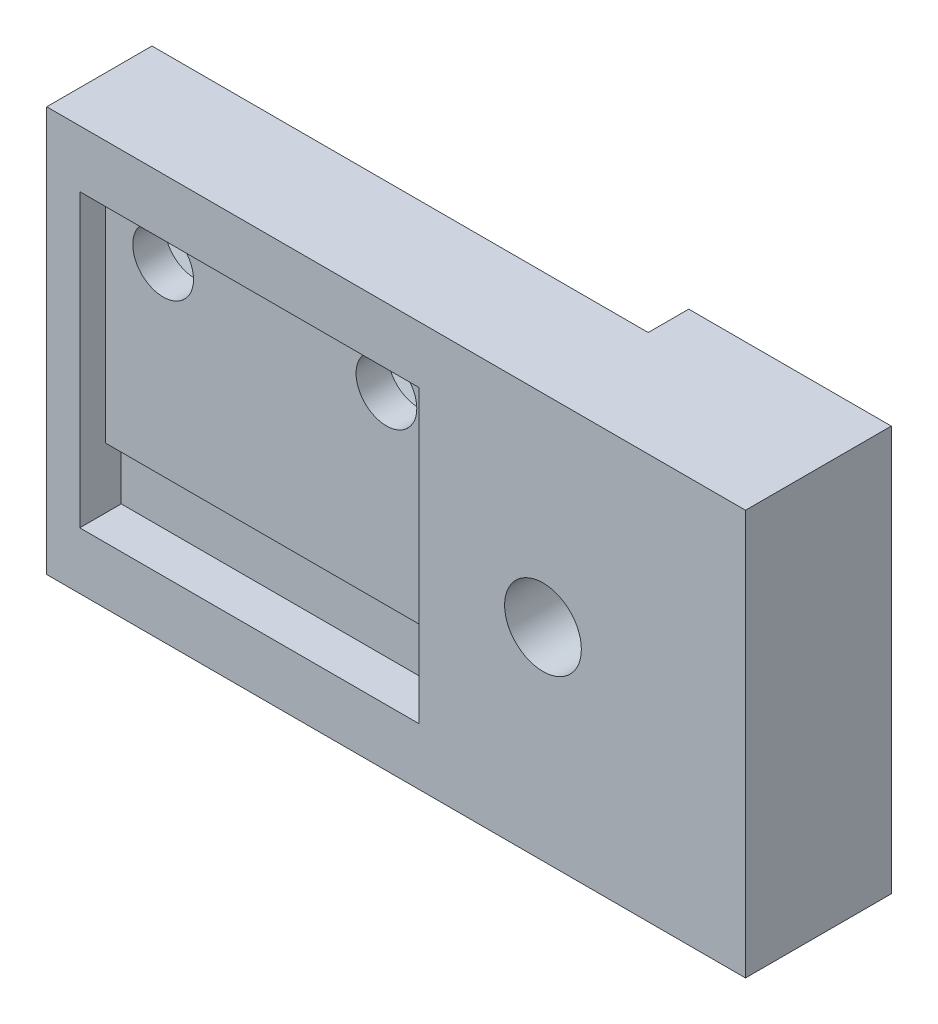
ISO-10303-21;
HEADER;
FILE_DESCRIPTION(('STEP AP214'),'2;1');
FILE_NAME('part.step','',(''),(''),'','','');
FILE_SCHEMA(('AUTOMOTIVE_DESIGN { 1 0 10303 214 1 1 1 1 }'));
ENDSEC;
DATA;
#1=APPLICATION_CONTEXT('core data for automotive mechanical design processes');
#2=APPLICATION_PROTOCOL_DEFINITION('international standard','automotive_design',2000,#1);
#3=PRODUCT_CONTEXT('',#1,'mechanical');
#4=PRODUCT('Part','Part','',(#3));
#5=PRODUCT_RELATED_PRODUCT_CATEGORY('part','',(#4));
#6=PRODUCT_DEFINITION_FORMATION('','',#4);
#7=PRODUCT_DEFINITION_CONTEXT('part definition',#1,'design');
#8=PRODUCT_DEFINITION('design','',#6,#7);
#9=PRODUCT_DEFINITION_SHAPE('','',#8);
#10=(LENGTH_UNIT() NAMED_UNIT(*) SI_UNIT(.MILLI.,.METRE.));
#11=(NAMED_UNIT(*) PLANE_ANGLE_UNIT() SI_UNIT($,.RADIAN.));
#12=(NAMED_UNIT(*) SI_UNIT($,.STERADIAN.) SOLID_ANGLE_UNIT());
#13=UNCERTAINTY_MEASURE_WITH_UNIT(LENGTH_MEASURE(1.E-05),#10,'distance_accuracy_value','');
#14=(GEOMETRIC_REPRESENTATION_CONTEXT(3) GLOBAL_UNCERTAINTY_ASSIGNED_CONTEXT((#13)) GLOBAL_UNIT_ASSIGNED_CONTEXT((#10,
#11,#12)) REPRESENTATION_CONTEXT('',''));
#15=CARTESIAN_POINT('',(0.,0.,0.));
#16=DIRECTION('',(0.,0.,1.));
#17=DIRECTION('',(1.,0.,0.));
#18=AXIS2_PLACEMENT_3D('',#15,#16,#17);
#19=CARTESIAN_POINT('',(0.,0.,0.));
#20=DIRECTION('',(0.,0.,-1.));
#21=DIRECTION('',(-1.,0.,0.));
#22=AXIS2_PLACEMENT_3D('',#19,#20,#21);
#23=PLANE('',#22);
#24=CARTESIAN_POINT('',(19.7,19.026000048,0.));
#25=DIRECTION('',(0.,0.,1.));
#26=DIRECTION('',(1.,0.,0.));
#27=AXIS2_PLACEMENT_3D('',#24,#25,#26);
#28=CIRCLE('',#27,1.9039967);
#29=CARTESIAN_POINT('',(21.6039967,19.026000048,0.));
#30=VERTEX_POINT('',#29);
#31=EDGE_CURVE('E556',#30,#30,#28,.T.);
#32=ORIENTED_EDGE('',*,*,#31,.T.);
#33=EDGE_LOOP('',(#32));
#34=FACE_BOUND('',#33,.T.);
#35=DIRECTION('',(-0.866025403784439,-0.5,0.));
#36=VECTOR('',#35,1.);
#37=CARTESIAN_POINT('',(22.8309945,17.2183195305938,0.));
#38=LINE('',#37,#36);
#39=CARTESIAN_POINT('',(22.8309945,17.2183195305938,0.));
#40=VERTEX_POINT('',#39);
#41=CARTESIAN_POINT('',(19.7,15.4106390131875,0.));
#42=VERTEX_POINT('',#41);
#43=EDGE_CURVE('E435',#40,#42,#38,.T.);
#44=ORIENTED_EDGE('',*,*,#43,.T.);
#45=DIRECTION('',(-0.866025403784439,0.5,0.));
#46=VECTOR('',#45,1.);
#47=CARTESIAN_POINT('',(19.7,15.4106390131875,0.));
#48=LINE('',#47,#46);
#49=CARTESIAN_POINT('',(16.5690055,17.2183195305938,0.));
#50=VERTEX_POINT('',#49);
#51=EDGE_CURVE('E430',#42,#50,#48,.T.);
#52=ORIENTED_EDGE('',*,*,#51,.T.);
#53=DIRECTION('',(0.,1.,0.));
#54=VECTOR('',#53,1.);
#55=CARTESIAN_POINT('',(16.5690055,17.2183195305938,0.));
#56=LINE('',#55,#54);
#57=CARTESIAN_POINT('',(16.5690055,20.8336805654062,0.));
#58=VERTEX_POINT('',#57);
#59=EDGE_CURVE('E455',#50,#58,#56,.T.);
#60=ORIENTED_EDGE('',*,*,#59,.T.);
#61=DIRECTION('',(0.866025403784438,0.5,0.));
#62=VECTOR('',#61,1.);
#63=CARTESIAN_POINT('',(16.5690055,20.8336805654062,0.));
#64=LINE('',#63,#62);
#65=CARTESIAN_POINT('',(19.7,22.6413610828125,0.));
#66=VERTEX_POINT('',#65);
#67=EDGE_CURVE('E459',#58,#66,#64,.T.);
#68=ORIENTED_EDGE('',*,*,#67,.T.);
#69=DIRECTION('',(0.866025403784438,-0.5,0.));
#70=VECTOR('',#69,1.);
#71=CARTESIAN_POINT('',(19.7,22.6413610828125,0.));
#72=LINE('',#71,#70);
#73=CARTESIAN_POINT('',(22.8309945,20.8336805654062,0.));
#74=VERTEX_POINT('',#73);
#75=EDGE_CURVE('E463',#66,#74,#72,.T.);
#76=ORIENTED_EDGE('',*,*,#75,.T.);
#77=DIRECTION('',(0.,-1.,0.));
#78=VECTOR('',#77,1.);
#79=CARTESIAN_POINT('',(22.8309945,20.8336805654062,0.));
#80=LINE('',#79,#78);
#81=EDGE_CURVE('E467',#74,#40,#80,.T.);
#82=ORIENTED_EDGE('',*,*,#81,.T.);
#83=EDGE_LOOP('',(#44,#52,#60,#68,#76,#82));
#84=FACE_BOUND('',#83,.T.);
#85=ADVANCED_FACE('F39',(#34,#84),#23,.T.);
#86=CARTESIAN_POINT('',(5.7,19.026000048,0.));
#87=DIRECTION('',(0.,0.,1.));
#88=DIRECTION('',(1.,0.,0.));
#89=AXIS2_PLACEMENT_3D('',#86,#87,#88);
#90=CIRCLE('',#89,1.9039967);
#91=CARTESIAN_POINT('',(7.6039967,19.026000048,0.));
#92=VERTEX_POINT('',#91);
#93=EDGE_CURVE('E561',#92,#92,#90,.T.);
#94=ORIENTED_EDGE('',*,*,#93,.T.);
#95=EDGE_LOOP('',(#94));
#96=FACE_BOUND('',#95,.T.);
#97=DIRECTION('',(-0.866025403784438,0.500000000000001,0.));
#98=VECTOR('',#97,1.);
#99=CARTESIAN_POINT('',(5.69999999999999,15.4106390131875,0.));
#100=LINE('',#99,#98);
#101=CARTESIAN_POINT('',(5.69999999999999,15.4106390131875,0.));
#102=VERTEX_POINT('',#101);
#103=CARTESIAN_POINT('',(2.56900549999999,17.2183195305938,0.));
#104=VERTEX_POINT('',#103);
#105=EDGE_CURVE('E373',#102,#104,#100,.T.);
#106=ORIENTED_EDGE('',*,*,#105,.T.);
#107=DIRECTION('',(0.,1.,0.));
#108=VECTOR('',#107,1.);
#109=CARTESIAN_POINT('',(2.56900549999999,17.2183195305938,0.));
#110=LINE('',#109,#108);
#111=CARTESIAN_POINT('',(2.56900549999999,20.8336805654062,0.));
#112=VERTEX_POINT('',#111);
#113=EDGE_CURVE('E368',#104,#112,#110,.T.);
#114=ORIENTED_EDGE('',*,*,#113,.T.);
#115=DIRECTION('',(0.866025403784439,0.5,0.));
#116=VECTOR('',#115,1.);
#117=CARTESIAN_POINT('',(2.56900549999999,20.8336805654062,0.));
#118=LINE('',#117,#116);
#119=CARTESIAN_POINT('',(5.69999999999999,22.6413610828125,0.));
#120=VERTEX_POINT('',#119);
#121=EDGE_CURVE('E393',#112,#120,#118,.T.);
#122=ORIENTED_EDGE('',*,*,#121,.T.);
#123=DIRECTION('',(0.866025403784439,-0.5,0.));
#124=VECTOR('',#123,1.);
#125=CARTESIAN_POINT('',(5.69999999999999,22.6413610828125,0.));
#126=LINE('',#125,#124);
#127=CARTESIAN_POINT('',(8.83099449999999,20.8336805654062,0.));
#128=VERTEX_POINT('',#127);
#129=EDGE_CURVE('E397',#120,#128,#126,.T.);
#130=ORIENTED_EDGE('',*,*,#129,.T.);
#131=DIRECTION('',(0.,-1.,0.));
#132=VECTOR('',#131,1.);
#133=CARTESIAN_POINT('',(8.83099449999999,20.8336805654062,0.));
#134=LINE('',#133,#132);
#135=CARTESIAN_POINT('',(8.83099449999999,17.2183195305938,0.));
#136=VERTEX_POINT('',#135);
#137=EDGE_CURVE('E401',#128,#136,#134,.T.);
#138=ORIENTED_EDGE('',*,*,#137,.T.);
#139=DIRECTION('',(-0.866025403784439,-0.5,0.));
#140=VECTOR('',#139,1.);
#141=CARTESIAN_POINT('',(8.83099449999999,17.2183195305938,0.));
#142=LINE('',#141,#140);
#143=EDGE_CURVE('E405',#136,#102,#142,.T.);
#144=ORIENTED_EDGE('',*,*,#143,.T.);
#145=EDGE_LOOP('',(#106,#114,#122,#130,#138,#144));
#146=FACE_BOUND('',#145,.T.);
#147=ADVANCED_FACE('F655',(#96,#146),#23,.T.);
#148=CARTESIAN_POINT('',(0.,0.,2.));
#149=DIRECTION('',(0.,0.,-1.));
#150=DIRECTION('',(-1.,0.,0.));
#151=AXIS2_PLACEMENT_3D('',#148,#149,#150);
#152=PLANE('',#151);
#153=DIRECTION('',(0.,-1.,0.));
#154=VECTOR('',#153,1.);
#155=CARTESIAN_POINT('',(2.073,3.573,2.));
#156=LINE('',#155,#154);
#157=CARTESIAN_POINT('',(2.073,21.827,2.));
#158=VERTEX_POINT('',#157);
#159=CARTESIAN_POINT('',(2.073,7.383,2.));
#160=VERTEX_POINT('',#159);
#161=EDGE_CURVE('E515',#158,#160,#156,.T.);
#162=ORIENTED_EDGE('',*,*,#161,.T.);
#163=DIRECTION('',(-1.,0.,0.));
#164=VECTOR('',#163,1.);
#165=CARTESIAN_POINT('',(2.073,7.383,2.));
#166=LINE('',#165,#164);
#167=CARTESIAN_POINT('',(23.327,7.383,2.));
#168=VERTEX_POINT('',#167);
#169=EDGE_CURVE('E265',#168,#160,#166,.T.);
#170=ORIENTED_EDGE('',*,*,#169,.F.);
#171=DIRECTION('',(0.,1.,0.));
#172=VECTOR('',#171,1.);
#173=CARTESIAN_POINT('',(23.327,3.573,2.));
#174=LINE('',#173,#172);
#175=CARTESIAN_POINT('',(23.327,21.827,2.));
#176=VERTEX_POINT('',#175);
#177=EDGE_CURVE('E510',#168,#176,#174,.T.);
#178=ORIENTED_EDGE('',*,*,#177,.T.);
#179=DIRECTION('',(-1.,0.,0.));
#180=VECTOR('',#179,1.);
#181=CARTESIAN_POINT('',(2.073,21.827,2.));
#182=LINE('',#181,#180);
#183=EDGE_CURVE('E525',#176,#158,#182,.T.);
#184=ORIENTED_EDGE('',*,*,#183,.T.);
#185=EDGE_LOOP('',(#162,#170,#178,#184));
#186=FACE_BOUND('',#185,.T.);
#187=CARTESIAN_POINT('',(5.7,19.026000048,2.));
#188=DIRECTION('',(0.,0.,1.));
#189=DIRECTION('',(1.,0.,0.));
#190=AXIS2_PLACEMENT_3D('',#187,#188,#189);
#191=CIRCLE('',#190,1.9039967);
#192=CARTESIAN_POINT('',(7.6039967,19.026000048,2.));
#193=VERTEX_POINT('',#192);
#194=EDGE_CURVE('E565',#193,#193,#191,.T.);
#195=ORIENTED_EDGE('',*,*,#194,.F.);
#196=EDGE_LOOP('',(#195));
#197=FACE_BOUND('',#196,.T.);
#198=CARTESIAN_POINT('',(19.7,19.026000048,2.));
#199=DIRECTION('',(0.,0.,1.));
#200=DIRECTION('',(1.,0.,0.));
#201=AXIS2_PLACEMENT_3D('',#198,#199,#200);
#202=CIRCLE('',#201,1.9039967);
#203=CARTESIAN_POINT('',(21.6039967,19.026000048,2.));
#204=VERTEX_POINT('',#203);
#205=EDGE_CURVE('E557',#204,#204,#202,.T.);
#206=ORIENTED_EDGE('',*,*,#205,.F.);
#207=EDGE_LOOP('',(#206));
#208=FACE_BOUND('',#207,.T.);
#209=ADVANCED_FACE('F684',(#186,#197,#208),#152,.F.);
#210=CARTESIAN_POINT('',(0.,0.,2.));
#211=DIRECTION('',(1.,0.,0.));
#212=DIRECTION('',(0.,0.,-1.));
#213=AXIS2_PLACEMENT_3D('',#210,#211,#212);
#214=PLANE('',#213);
#215=DIRECTION('',(0.,0.,-1.));
#216=VECTOR('',#215,1.);
#217=CARTESIAN_POINT('',(0.,25.4,2.));
#218=LINE('',#217,#216);
#219=CARTESIAN_POINT('',(0.,25.4,3.6));
#220=VERTEX_POINT('',#219);
#221=CARTESIAN_POINT('',(0.,25.4,-3.));
#222=VERTEX_POINT('',#221);
#223=EDGE_CURVE('E569',#220,#222,#218,.T.);
#224=ORIENTED_EDGE('',*,*,#223,.T.);
#225=DIRECTION('',(0.,1.,0.));
#226=VECTOR('',#225,1.);
#227=CARTESIAN_POINT('',(0.,0.,-3.));
#228=LINE('',#227,#226);
#229=CARTESIAN_POINT('',(0.,0.,-3.));
#230=VERTEX_POINT('',#229);
#231=EDGE_CURVE('E499',#230,#222,#228,.T.);
#232=ORIENTED_EDGE('',*,*,#231,.F.);
#233=DIRECTION('',(0.,0.,-1.));
#234=VECTOR('',#233,1.);
#235=CARTESIAN_POINT('',(0.,0.,2.));
#236=LINE('',#235,#234);
#237=CARTESIAN_POINT('',(0.,0.,3.6));
#238=VERTEX_POINT('',#237);
#239=EDGE_CURVE('E11',#238,#230,#236,.T.);
#240=ORIENTED_EDGE('',*,*,#239,.F.);
#241=DIRECTION('',(0.,-1.,0.));
#242=VECTOR('',#241,1.);
#243=CARTESIAN_POINT('',(0.,25.4,3.6));
#244=LINE('',#243,#242);
#245=EDGE_CURVE('E544',#220,#238,#244,.T.);
#246=ORIENTED_EDGE('',*,*,#245,.F.);
#247=EDGE_LOOP('',(#224,#232,#240,#246));
#248=FACE_BOUND('',#247,.T.);
#249=ADVANCED_FACE('F41',(#248),#214,.F.);
#250=CARTESIAN_POINT('',(0.,0.,2.));
#251=DIRECTION('',(0.,1.,0.));
#252=DIRECTION('',(0.,0.,1.));
#253=AXIS2_PLACEMENT_3D('',#250,#251,#252);
#254=PLANE('',#253);
#255=ORIENTED_EDGE('',*,*,#239,.T.);
#256=DIRECTION('',(-1.,0.,0.));
#257=VECTOR('',#256,1.);
#258=CARTESIAN_POINT('',(43.815,0.,-3.));
#259=LINE('',#258,#257);
#260=CARTESIAN_POINT('',(31.115,0.,-3.));
#261=VERTEX_POINT('',#260);
#262=EDGE_CURVE('E496',#261,#230,#259,.T.);
#263=ORIENTED_EDGE('',*,*,#262,.F.);
#264=DIRECTION('',(0.,0.,1.));
#265=VECTOR('',#264,1.);
#266=CARTESIAN_POINT('',(31.115,0.,-5.54));
#267=LINE('',#266,#265);
#268=CARTESIAN_POINT('',(31.115,0.,-5.54));
#269=VERTEX_POINT('',#268);
#270=EDGE_CURVE('E364',#269,#261,#267,.T.);
#271=ORIENTED_EDGE('',*,*,#270,.F.);
#272=DIRECTION('',(-1.,0.,0.));
#273=VECTOR('',#272,1.);
#274=CARTESIAN_POINT('',(43.815,0.,-5.54));
#275=LINE('',#274,#273);
#276=CARTESIAN_POINT('',(43.815,0.,-5.54));
#277=VERTEX_POINT('',#276);
#278=EDGE_CURVE('E290',#277,#269,#275,.T.);
#279=ORIENTED_EDGE('',*,*,#278,.F.);
#280=DIRECTION('',(0.,0.,-1.));
#281=VECTOR('',#280,1.);
#282=CARTESIAN_POINT('',(43.815,0.,2.));
#283=LINE('',#282,#281);
#284=CARTESIAN_POINT('',(43.815,0.,3.6));
#285=VERTEX_POINT('',#284);
#286=EDGE_CURVE('E48',#285,#277,#283,.T.);
#287=ORIENTED_EDGE('',*,*,#286,.F.);
#288=DIRECTION('',(1.,0.,0.));
#289=VECTOR('',#288,1.);
#290=CARTESIAN_POINT('',(0.,0.,3.6));
#291=LINE('',#290,#289);
#292=EDGE_CURVE('E548',#238,#285,#291,.T.);
#293=ORIENTED_EDGE('',*,*,#292,.F.);
#294=EDGE_LOOP('',(#255,#263,#271,#279,#287,#293));
#295=FACE_BOUND('',#294,.T.);
#296=ADVANCED_FACE('F589',(#295),#254,.F.);
#297=CARTESIAN_POINT('',(43.815,0.,2.));
#298=DIRECTION('',(-1.,0.,0.));
#299=DIRECTION('',(0.,0.,1.));
#300=AXIS2_PLACEMENT_3D('',#297,#298,#299);
#301=PLANE('',#300);
#302=ORIENTED_EDGE('',*,*,#286,.T.);
#303=DIRECTION('',(0.,-1.,0.));
#304=VECTOR('',#303,1.);
#305=CARTESIAN_POINT('',(43.815,25.4,-5.54));
#306=LINE('',#305,#304);
#307=CARTESIAN_POINT('',(43.815,25.4,-5.54));
#308=VERTEX_POINT('',#307);
#309=EDGE_CURVE('E286',#308,#277,#306,.T.);
#310=ORIENTED_EDGE('',*,*,#309,.F.);
#311=DIRECTION('',(0.,0.,-1.));
#312=VECTOR('',#311,1.);
#313=CARTESIAN_POINT('',(43.815,25.4,2.));
#314=LINE('',#313,#312);
#315=CARTESIAN_POINT('',(43.815,25.4,3.6));
#316=VERTEX_POINT('',#315);
#317=EDGE_CURVE('E575',#316,#308,#314,.T.);
#318=ORIENTED_EDGE('',*,*,#317,.F.);
#319=DIRECTION('',(0.,1.,0.));
#320=VECTOR('',#319,1.);
#321=CARTESIAN_POINT('',(43.815,0.,3.6));
#322=LINE('',#321,#320);
#323=EDGE_CURVE('E552',#285,#316,#322,.T.);
#324=ORIENTED_EDGE('',*,*,#323,.F.);
#325=EDGE_LOOP('',(#302,#310,#318,#324));
#326=FACE_BOUND('',#325,.T.);
#327=ADVANCED_FACE('F581',(#326),#301,.F.);
#328=CARTESIAN_POINT('',(0.,25.4,2.));
#329=DIRECTION('',(0.,-1.,0.));
#330=DIRECTION('',(0.,0.,-1.));
#331=AXIS2_PLACEMENT_3D('',#328,#329,#330);
#332=PLANE('',#331);
#333=ORIENTED_EDGE('',*,*,#317,.T.);
#334=DIRECTION('',(1.,0.,0.));
#335=VECTOR('',#334,1.);
#336=CARTESIAN_POINT('',(31.115,25.4,-5.54));
#337=LINE('',#336,#335);
#338=CARTESIAN_POINT('',(31.115,25.4,-5.54));
#339=VERTEX_POINT('',#338);
#340=EDGE_CURVE('E282',#339,#308,#337,.T.);
#341=ORIENTED_EDGE('',*,*,#340,.F.);
#342=DIRECTION('',(0.,0.,1.));
#343=VECTOR('',#342,1.);
#344=CARTESIAN_POINT('',(31.115,25.4,-5.54));
#345=LINE('',#344,#343);
#346=CARTESIAN_POINT('',(31.115,25.4,-3.));
#347=VERTEX_POINT('',#346);
#348=EDGE_CURVE('E314',#339,#347,#345,.T.);
#349=ORIENTED_EDGE('',*,*,#348,.T.);
#350=DIRECTION('',(1.,0.,0.));
#351=VECTOR('',#350,1.);
#352=CARTESIAN_POINT('',(0.,25.4,-3.));
#353=LINE('',#352,#351);
#354=EDGE_CURVE('E503',#222,#347,#353,.T.);
#355=ORIENTED_EDGE('',*,*,#354,.F.);
#356=ORIENTED_EDGE('',*,*,#223,.F.);
#357=DIRECTION('',(-1.,0.,0.));
#358=VECTOR('',#357,1.);
#359=CARTESIAN_POINT('',(43.815,25.4,3.6));
#360=LINE('',#359,#358);
#361=EDGE_CURVE('E540',#316,#220,#360,.T.);
#362=ORIENTED_EDGE('',*,*,#361,.F.);
#363=EDGE_LOOP('',(#333,#341,#349,#355,#356,#362));
#364=FACE_BOUND('',#363,.T.);
#365=ADVANCED_FACE('F621',(#364),#332,.F.);
#366=CARTESIAN_POINT('',(5.7,19.026000048,2.));
#367=DIRECTION('',(0.,0.,-1.));
#368=DIRECTION('',(-1.,0.,0.));
#369=AXIS2_PLACEMENT_3D('',#366,#367,#368);
#370=CYLINDRICAL_SURFACE('',#369,1.9039967);
#371=ORIENTED_EDGE('',*,*,#194,.T.);
#372=EDGE_LOOP('',(#371));
#373=FACE_BOUND('',#372,.T.);
#374=ORIENTED_EDGE('',*,*,#93,.F.);
#375=EDGE_LOOP('',(#374));
#376=FACE_BOUND('',#375,.T.);
#377=ADVANCED_FACE('F692',(#373,#376),#370,.F.);
#378=CARTESIAN_POINT('',(19.7,19.026000048,2.));
#379=DIRECTION('',(0.,0.,-1.));
#380=DIRECTION('',(-1.,0.,0.));
#381=AXIS2_PLACEMENT_3D('',#378,#379,#380);
#382=CYLINDRICAL_SURFACE('',#381,1.9039967);
#383=ORIENTED_EDGE('',*,*,#205,.T.);
#384=EDGE_LOOP('',(#383));
#385=FACE_BOUND('',#384,.T.);
#386=ORIENTED_EDGE('',*,*,#31,.F.);
#387=EDGE_LOOP('',(#386));
#388=FACE_BOUND('',#387,.T.);
#389=ADVANCED_FACE('F710',(#385,#388),#382,.F.);
#390=CARTESIAN_POINT('',(31.115,12.7,2.));
#391=DIRECTION('',(0.,0.,-1.));
#392=DIRECTION('',(-1.,0.,0.));
#393=AXIS2_PLACEMENT_3D('',#390,#391,#392);
#394=CYLINDRICAL_SURFACE('',#393,2.40665);
#395=CARTESIAN_POINT('',(31.115,12.7,3.6));
#396=DIRECTION('',(0.,0.,1.));
#397=DIRECTION('',(1.,0.,0.));
#398=AXIS2_PLACEMENT_3D('',#395,#396,#397);
#399=CIRCLE('',#398,2.40665);
#400=CARTESIAN_POINT('',(33.52165,12.7,3.6));
#401=VERTEX_POINT('',#400);
#402=EDGE_CURVE('E506',#401,#401,#399,.T.);
#403=ORIENTED_EDGE('',*,*,#402,.T.);
#404=EDGE_LOOP('',(#403));
#405=FACE_BOUND('',#404,.T.);
#406=CARTESIAN_POINT('',(31.115,12.7,-3.));
#407=DIRECTION('',(0.,0.,-1.));
#408=DIRECTION('',(-1.,0.,0.));
#409=AXIS2_PLACEMENT_3D('',#406,#407,#408);
#410=CIRCLE('',#409,2.40665);
#411=CARTESIAN_POINT('',(28.70835,12.7,-3.));
#412=VERTEX_POINT('',#411);
#413=EDGE_CURVE('E492',#412,#412,#410,.T.);
#414=ORIENTED_EDGE('',*,*,#413,.T.);
#415=EDGE_LOOP('',(#414));
#416=FACE_BOUND('',#415,.T.);
#417=ADVANCED_FACE('F713',(#405,#416),#394,.F.);
#418=CARTESIAN_POINT('',(0.,0.,3.6));
#419=DIRECTION('',(0.,0.,1.));
#420=DIRECTION('',(1.,0.,0.));
#421=AXIS2_PLACEMENT_3D('',#418,#419,#420);
#422=PLANE('',#421);
#423=DIRECTION('',(-1.,0.,0.));
#424=VECTOR('',#423,1.);
#425=CARTESIAN_POINT('',(2.073,21.827,3.6));
#426=LINE('',#425,#424);
#427=CARTESIAN_POINT('',(23.327,21.827,3.6));
#428=VERTEX_POINT('',#427);
#429=CARTESIAN_POINT('',(2.073,21.827,3.6));
#430=VERTEX_POINT('',#429);
#431=EDGE_CURVE('E514',#428,#430,#426,.T.);
#432=ORIENTED_EDGE('',*,*,#431,.F.);
#433=DIRECTION('',(0.,1.,0.));
#434=VECTOR('',#433,1.);
#435=CARTESIAN_POINT('',(23.327,3.573,3.6));
#436=LINE('',#435,#434);
#437=CARTESIAN_POINT('',(23.327,3.573,3.6));
#438=VERTEX_POINT('',#437);
#439=EDGE_CURVE('E511',#438,#428,#436,.T.);
#440=ORIENTED_EDGE('',*,*,#439,.F.);
#441=DIRECTION('',(1.,0.,0.));
#442=VECTOR('',#441,1.);
#443=CARTESIAN_POINT('',(2.073,3.573,3.6));
#444=LINE('',#443,#442);
#445=CARTESIAN_POINT('',(2.073,3.573,3.6));
#446=VERTEX_POINT('',#445);
#447=EDGE_CURVE('E520',#446,#438,#444,.T.);
#448=ORIENTED_EDGE('',*,*,#447,.F.);
#449=DIRECTION('',(0.,-1.,0.));
#450=VECTOR('',#449,1.);
#451=CARTESIAN_POINT('',(2.073,3.573,3.6));
#452=LINE('',#451,#450);
#453=EDGE_CURVE('E244',#430,#446,#452,.T.);
#454=ORIENTED_EDGE('',*,*,#453,.F.);
#455=EDGE_LOOP('',(#432,#440,#448,#454));
#456=FACE_BOUND('',#455,.T.);
#457=ORIENTED_EDGE('',*,*,#361,.T.);
#458=ORIENTED_EDGE('',*,*,#245,.T.);
#459=ORIENTED_EDGE('',*,*,#292,.T.);
#460=ORIENTED_EDGE('',*,*,#323,.T.);
#461=EDGE_LOOP('',(#457,#458,#459,#460));
#462=FACE_BOUND('',#461,.T.);
#463=ORIENTED_EDGE('',*,*,#402,.F.);
#464=EDGE_LOOP('',(#463));
#465=FACE_BOUND('',#464,.T.);
#466=ADVANCED_FACE('F624',(#456,#462,#465),#422,.T.);
#467=CARTESIAN_POINT('',(23.327,3.573,3.6));
#468=DIRECTION('',(-1.,0.,0.));
#469=DIRECTION('',(0.,0.,1.));
#470=AXIS2_PLACEMENT_3D('',#467,#468,#469);
#471=PLANE('',#470);
#472=ORIENTED_EDGE('',*,*,#177,.F.);
#473=DIRECTION('',(0.,0.,1.));
#474=VECTOR('',#473,1.);
#475=CARTESIAN_POINT('',(23.327,7.383,1.));
#476=LINE('',#475,#474);
#477=CARTESIAN_POINT('',(23.327,7.383,1.));
#478=VERTEX_POINT('',#477);
#479=EDGE_CURVE('E274',#478,#168,#476,.T.);
#480=ORIENTED_EDGE('',*,*,#479,.F.);
#481=DIRECTION('',(0.,1.,0.));
#482=VECTOR('',#481,1.);
#483=CARTESIAN_POINT('',(23.327,7.383,1.));
#484=LINE('',#483,#482);
#485=CARTESIAN_POINT('',(23.327,3.573,1.));
#486=VERTEX_POINT('',#485);
#487=EDGE_CURVE('E259',#486,#478,#484,.T.);
#488=ORIENTED_EDGE('',*,*,#487,.F.);
#489=DIRECTION('',(0.,0.,-1.));
#490=VECTOR('',#489,1.);
#491=CARTESIAN_POINT('',(23.327,3.573,3.6));
#492=LINE('',#491,#490);
#493=EDGE_CURVE('E249',#438,#486,#492,.T.);
#494=ORIENTED_EDGE('',*,*,#493,.F.);
#495=ORIENTED_EDGE('',*,*,#439,.T.);
#496=DIRECTION('',(0.,0.,-1.));
#497=VECTOR('',#496,1.);
#498=CARTESIAN_POINT('',(23.327,21.827,3.6));
#499=LINE('',#498,#497);
#500=EDGE_CURVE('E536',#428,#176,#499,.T.);
#501=ORIENTED_EDGE('',*,*,#500,.T.);
#502=EDGE_LOOP('',(#472,#480,#488,#494,#495,#501));
#503=FACE_BOUND('',#502,.T.);
#504=ADVANCED_FACE('F726',(#503),#471,.T.);
#505=CARTESIAN_POINT('',(2.073,21.827,3.6));
#506=DIRECTION('',(0.,-1.,0.));
#507=DIRECTION('',(0.,0.,-1.));
#508=AXIS2_PLACEMENT_3D('',#505,#506,#507);
#509=PLANE('',#508);
#510=ORIENTED_EDGE('',*,*,#183,.F.);
#511=ORIENTED_EDGE('',*,*,#500,.F.);
#512=ORIENTED_EDGE('',*,*,#431,.T.);
#513=DIRECTION('',(0.,0.,-1.));
#514=VECTOR('',#513,1.);
#515=CARTESIAN_POINT('',(2.073,21.827,3.6));
#516=LINE('',#515,#514);
#517=EDGE_CURVE('E248',#430,#158,#516,.T.);
#518=ORIENTED_EDGE('',*,*,#517,.T.);
#519=EDGE_LOOP('',(#510,#511,#512,#518));
#520=FACE_BOUND('',#519,.T.);
#521=ADVANCED_FACE('F730',(#520),#509,.T.);
#522=CARTESIAN_POINT('',(2.073,3.573,3.6));
#523=DIRECTION('',(1.,0.,0.));
#524=DIRECTION('',(0.,0.,-1.));
#525=AXIS2_PLACEMENT_3D('',#522,#523,#524);
#526=PLANE('',#525);
#527=ORIENTED_EDGE('',*,*,#161,.F.);
#528=ORIENTED_EDGE('',*,*,#517,.F.);
#529=ORIENTED_EDGE('',*,*,#453,.T.);
#530=DIRECTION('',(0.,0.,-1.));
#531=VECTOR('',#530,1.);
#532=CARTESIAN_POINT('',(2.073,3.573,3.6));
#533=LINE('',#532,#531);
#534=CARTESIAN_POINT('',(2.073,3.573,1.));
#535=VERTEX_POINT('',#534);
#536=EDGE_CURVE('E235',#446,#535,#533,.T.);
#537=ORIENTED_EDGE('',*,*,#536,.T.);
#538=DIRECTION('',(0.,-1.,0.));
#539=VECTOR('',#538,1.);
#540=CARTESIAN_POINT('',(2.073,7.383,1.));
#541=LINE('',#540,#539);
#542=CARTESIAN_POINT('',(2.073,7.383,1.));
#543=VERTEX_POINT('',#542);
#544=EDGE_CURVE('E240',#543,#535,#541,.T.);
#545=ORIENTED_EDGE('',*,*,#544,.F.);
#546=DIRECTION('',(0.,0.,1.));
#547=VECTOR('',#546,1.);
#548=CARTESIAN_POINT('',(2.073,7.383,1.));
#549=LINE('',#548,#547);
#550=EDGE_CURVE('E276',#543,#160,#549,.T.);
#551=ORIENTED_EDGE('',*,*,#550,.T.);
#552=EDGE_LOOP('',(#527,#528,#529,#537,#545,#551));
#553=FACE_BOUND('',#552,.T.);
#554=ADVANCED_FACE('F238',(#553),#526,.T.);
#555=CARTESIAN_POINT('',(2.073,3.573,3.6));
#556=DIRECTION('',(0.,1.,0.));
#557=DIRECTION('',(0.,0.,1.));
#558=AXIS2_PLACEMENT_3D('',#555,#556,#557);
#559=PLANE('',#558);
#560=ORIENTED_EDGE('',*,*,#493,.T.);
#561=DIRECTION('',(1.,0.,0.));
#562=VECTOR('',#561,1.);
#563=CARTESIAN_POINT('',(2.073,3.573,1.));
#564=LINE('',#563,#562);
#565=EDGE_CURVE('E252',#535,#486,#564,.T.);
#566=ORIENTED_EDGE('',*,*,#565,.F.);
#567=ORIENTED_EDGE('',*,*,#536,.F.);
#568=ORIENTED_EDGE('',*,*,#447,.T.);
#569=EDGE_LOOP('',(#560,#566,#567,#568));
#570=FACE_BOUND('',#569,.T.);
#571=ADVANCED_FACE('F253',(#570),#559,.T.);
#572=CARTESIAN_POINT('',(0.,0.,-3.));
#573=DIRECTION('',(0.,0.,-1.));
#574=DIRECTION('',(-1.,0.,0.));
#575=AXIS2_PLACEMENT_3D('',#572,#573,#574);
#576=PLANE('',#575);
#577=DIRECTION('',(0.,1.,0.));
#578=VECTOR('',#577,1.);
#579=CARTESIAN_POINT('',(31.115,25.4,-3.));
#580=LINE('',#579,#578);
#581=CARTESIAN_POINT('',(31.115,21.717,-3.));
#582=VERTEX_POINT('',#581);
#583=EDGE_CURVE('E55',#582,#347,#580,.T.);
#584=ORIENTED_EDGE('',*,*,#583,.F.);
#585=DIRECTION('',(-1.,0.,0.));
#586=VECTOR('',#585,1.);
#587=CARTESIAN_POINT('',(31.115,21.717,-3.));
#588=LINE('',#587,#586);
#589=CARTESIAN_POINT('',(32.615185644448,21.717,-3.));
#590=VERTEX_POINT('',#589);
#591=EDGE_CURVE('E59',#590,#582,#588,.T.);
#592=ORIENTED_EDGE('',*,*,#591,.F.);
#593=CARTESIAN_POINT('',(32.615185644448,14.2001856444481,-3.));
#594=DIRECTION('',(0.,0.,1.));
#595=DIRECTION('',(-1.,0.,0.));
#596=AXIS2_PLACEMENT_3D('',#593,#594,#595);
#597=CIRCLE('',#596,7.51681435555195);
#598=CARTESIAN_POINT('',(40.1319999999999,14.2001856444481,-3.));
#599=VERTEX_POINT('',#598);
#600=EDGE_CURVE('E330',#599,#590,#597,.T.);
#601=ORIENTED_EDGE('',*,*,#600,.F.);
#602=DIRECTION('',(0.,1.,0.));
#603=VECTOR('',#602,1.);
#604=CARTESIAN_POINT('',(40.1319999999999,14.2001856444481,-3.));
#605=LINE('',#604,#603);
#606=CARTESIAN_POINT('',(40.1319999999999,11.1998143555519,-3.));
#607=VERTEX_POINT('',#606);
#608=EDGE_CURVE('E326',#607,#599,#605,.T.);
#609=ORIENTED_EDGE('',*,*,#608,.F.);
#610=CARTESIAN_POINT('',(32.615185644448,11.1998143555519,-3.));
#611=DIRECTION('',(0.,0.,1.));
#612=DIRECTION('',(-1.,0.,0.));
#613=AXIS2_PLACEMENT_3D('',#610,#611,#612);
#614=CIRCLE('',#613,7.51681435555196);
#615=CARTESIAN_POINT('',(32.615185644448,3.68299999999998,-3.));
#616=VERTEX_POINT('',#615);
#617=EDGE_CURVE('E322',#616,#607,#614,.T.);
#618=ORIENTED_EDGE('',*,*,#617,.F.);
#619=DIRECTION('',(1.,0.,0.));
#620=VECTOR('',#619,1.);
#621=CARTESIAN_POINT('',(31.115,3.683,-3.));
#622=LINE('',#621,#620);
#623=CARTESIAN_POINT('',(31.115,3.683,-3.));
#624=VERTEX_POINT('',#623);
#625=EDGE_CURVE('E318',#624,#616,#622,.T.);
#626=ORIENTED_EDGE('',*,*,#625,.F.);
#627=DIRECTION('',(0.,1.,0.));
#628=VECTOR('',#627,1.);
#629=CARTESIAN_POINT('',(31.115,0.,-3.));
#630=LINE('',#629,#628);
#631=EDGE_CURVE('E279',#261,#624,#630,.T.);
#632=ORIENTED_EDGE('',*,*,#631,.F.);
#633=ORIENTED_EDGE('',*,*,#262,.T.);
#634=ORIENTED_EDGE('',*,*,#231,.T.);
#635=ORIENTED_EDGE('',*,*,#354,.T.);
#636=EDGE_LOOP('',(#584,#592,#601,#609,#618,#626,#632,#633,#634,#635));
#637=FACE_BOUND('',#636,.T.);
#638=ORIENTED_EDGE('',*,*,#413,.F.);
#639=EDGE_LOOP('',(#638));
#640=FACE_BOUND('',#639,.T.);
#641=DIRECTION('',(0.,1.,0.));
#642=VECTOR('',#641,1.);
#643=CARTESIAN_POINT('',(16.5690055,17.2183195305938,-3.));
#644=LINE('',#643,#642);
#645=CARTESIAN_POINT('',(16.5690055,17.2183195305938,-3.));
#646=VERTEX_POINT('',#645);
#647=CARTESIAN_POINT('',(16.5690055,20.8336805654062,-3.));
#648=VERTEX_POINT('',#647);
#649=EDGE_CURVE('E434',#646,#648,#644,.T.);
#650=ORIENTED_EDGE('',*,*,#649,.F.);
#651=DIRECTION('',(-0.866025403784439,0.5,0.));
#652=VECTOR('',#651,1.);
#653=CARTESIAN_POINT('',(19.7,15.4106390131875,-3.));
#654=LINE('',#653,#652);
#655=CARTESIAN_POINT('',(19.7,15.4106390131875,-3.));
#656=VERTEX_POINT('',#655);
#657=EDGE_CURVE('E431',#656,#646,#654,.T.);
#658=ORIENTED_EDGE('',*,*,#657,.F.);
#659=DIRECTION('',(-0.866025403784439,-0.5,0.));
#660=VECTOR('',#659,1.);
#661=CARTESIAN_POINT('',(22.8309945,17.2183195305938,-3.));
#662=LINE('',#661,#660);
#663=CARTESIAN_POINT('',(22.8309945,17.2183195305938,-3.));
#664=VERTEX_POINT('',#663);
#665=EDGE_CURVE('E448',#664,#656,#662,.T.);
#666=ORIENTED_EDGE('',*,*,#665,.F.);
#667=DIRECTION('',(0.,-1.,0.));
#668=VECTOR('',#667,1.);
#669=CARTESIAN_POINT('',(22.8309945,20.8336805654062,-3.));
#670=LINE('',#669,#668);
#671=CARTESIAN_POINT('',(22.8309945,20.8336805654062,-3.));
#672=VERTEX_POINT('',#671);
#673=EDGE_CURVE('E444',#672,#664,#670,.T.);
#674=ORIENTED_EDGE('',*,*,#673,.F.);
#675=DIRECTION('',(0.866025403784438,-0.5,0.));
#676=VECTOR('',#675,1.);
#677=CARTESIAN_POINT('',(19.7,22.6413610828125,-3.));
#678=LINE('',#677,#676);
#679=CARTESIAN_POINT('',(19.7,22.6413610828125,-3.));
#680=VERTEX_POINT('',#679);
#681=EDGE_CURVE('E441',#680,#672,#678,.T.);
#682=ORIENTED_EDGE('',*,*,#681,.F.);
#683=DIRECTION('',(0.866025403784438,0.5,0.));
#684=VECTOR('',#683,1.);
#685=CARTESIAN_POINT('',(16.5690055,20.8336805654062,-3.));
#686=LINE('',#685,#684);
#687=EDGE_CURVE('E438',#648,#680,#686,.T.);
#688=ORIENTED_EDGE('',*,*,#687,.F.);
#689=EDGE_LOOP('',(#650,#658,#666,#674,#682,#688));
#690=FACE_BOUND('',#689,.T.);
#691=DIRECTION('',(0.866025403784439,0.5,0.));
#692=VECTOR('',#691,1.);
#693=CARTESIAN_POINT('',(2.56900549999999,20.8336805654062,-3.));
#694=LINE('',#693,#692);
#695=CARTESIAN_POINT('',(2.56900549999999,20.8336805654062,-3.));
#696=VERTEX_POINT('',#695);
#697=CARTESIAN_POINT('',(5.69999999999999,22.6413610828125,-3.));
#698=VERTEX_POINT('',#697);
#699=EDGE_CURVE('E372',#696,#698,#694,.T.);
#700=ORIENTED_EDGE('',*,*,#699,.F.);
#701=DIRECTION('',(0.,1.,0.));
#702=VECTOR('',#701,1.);
#703=CARTESIAN_POINT('',(2.56900549999999,17.2183195305938,-3.));
#704=LINE('',#703,#702);
#705=CARTESIAN_POINT('',(2.56900549999999,17.2183195305938,-3.));
#706=VERTEX_POINT('',#705);
#707=EDGE_CURVE('E369',#706,#696,#704,.T.);
#708=ORIENTED_EDGE('',*,*,#707,.F.);
#709=DIRECTION('',(-0.866025403784438,0.500000000000001,0.));
#710=VECTOR('',#709,1.);
#711=CARTESIAN_POINT('',(5.69999999999999,15.4106390131875,-3.));
#712=LINE('',#711,#710);
#713=CARTESIAN_POINT('',(5.69999999999999,15.4106390131875,-3.));
#714=VERTEX_POINT('',#713);
#715=EDGE_CURVE('E386',#714,#706,#712,.T.);
#716=ORIENTED_EDGE('',*,*,#715,.F.);
#717=DIRECTION('',(-0.866025403784439,-0.5,0.));
#718=VECTOR('',#717,1.);
#719=CARTESIAN_POINT('',(8.83099449999999,17.2183195305938,-3.));
#720=LINE('',#719,#718);
#721=CARTESIAN_POINT('',(8.83099449999999,17.2183195305938,-3.));
#722=VERTEX_POINT('',#721);
#723=EDGE_CURVE('E382',#722,#714,#720,.T.);
#724=ORIENTED_EDGE('',*,*,#723,.F.);
#725=DIRECTION('',(0.,-1.,0.));
#726=VECTOR('',#725,1.);
#727=CARTESIAN_POINT('',(8.83099449999999,20.8336805654062,-3.));
#728=LINE('',#727,#726);
#729=CARTESIAN_POINT('',(8.83099449999999,20.8336805654062,-3.));
#730=VERTEX_POINT('',#729);
#731=EDGE_CURVE('E379',#730,#722,#728,.T.);
#732=ORIENTED_EDGE('',*,*,#731,.F.);
#733=DIRECTION('',(0.866025403784439,-0.5,0.));
#734=VECTOR('',#733,1.);
#735=CARTESIAN_POINT('',(5.69999999999999,22.6413610828125,-3.));
#736=LINE('',#735,#734);
#737=EDGE_CURVE('E376',#698,#730,#736,.T.);
#738=ORIENTED_EDGE('',*,*,#737,.F.);
#739=EDGE_LOOP('',(#700,#708,#716,#724,#732,#738));
#740=FACE_BOUND('',#739,.T.);
#741=ADVANCED_FACE('F629',(#637,#640,#690,#740),#576,.T.);
#742=CARTESIAN_POINT('',(19.7,15.4106390131875,-3.));
#743=DIRECTION('',(0.499999999999999,0.866025403784439,0.));
#744=DIRECTION('',(-0.866025403784439,0.5,0.));
#745=AXIS2_PLACEMENT_3D('',#742,#743,#744);
#746=PLANE('',#745);
#747=ORIENTED_EDGE('',*,*,#51,.F.);
#748=DIRECTION('',(0.,0.,1.));
#749=VECTOR('',#748,1.);
#750=CARTESIAN_POINT('',(19.7,15.4106390131875,-3.));
#751=LINE('',#750,#749);
#752=EDGE_CURVE('E451',#656,#42,#751,.T.);
#753=ORIENTED_EDGE('',*,*,#752,.F.);
#754=ORIENTED_EDGE('',*,*,#657,.T.);
#755=DIRECTION('',(0.,0.,1.));
#756=VECTOR('',#755,1.);
#757=CARTESIAN_POINT('',(16.5690055,17.2183195305938,-3.));
#758=LINE('',#757,#756);
#759=EDGE_CURVE('E488',#646,#50,#758,.T.);
#760=ORIENTED_EDGE('',*,*,#759,.T.);
#761=EDGE_LOOP('',(#747,#753,#754,#760));
#762=FACE_BOUND('',#761,.T.);
#763=ADVANCED_FACE('F632',(#762),#746,.T.);
#764=CARTESIAN_POINT('',(16.5690055,17.2183195305938,-3.));
#765=DIRECTION('',(1.,0.,0.));
#766=DIRECTION('',(0.,0.,-1.));
#767=AXIS2_PLACEMENT_3D('',#764,#765,#766);
#768=PLANE('',#767);
#769=ORIENTED_EDGE('',*,*,#59,.F.);
#770=ORIENTED_EDGE('',*,*,#759,.F.);
#771=ORIENTED_EDGE('',*,*,#649,.T.);
#772=DIRECTION('',(0.,0.,1.));
#773=VECTOR('',#772,1.);
#774=CARTESIAN_POINT('',(16.5690055,20.8336805654062,-3.));
#775=LINE('',#774,#773);
#776=EDGE_CURVE('E485',#648,#58,#775,.T.);
#777=ORIENTED_EDGE('',*,*,#776,.T.);
#778=EDGE_LOOP('',(#769,#770,#771,#777));
#779=FACE_BOUND('',#778,.T.);
#780=ADVANCED_FACE('F741',(#779),#768,.T.);
#781=CARTESIAN_POINT('',(16.5690055,20.8336805654062,-3.));
#782=DIRECTION('',(0.5,-0.866025403784438,0.));
#783=DIRECTION('',(0.866025403784438,0.5,0.));
#784=AXIS2_PLACEMENT_3D('',#781,#782,#783);
#785=PLANE('',#784);
#786=ORIENTED_EDGE('',*,*,#67,.F.);
#787=ORIENTED_EDGE('',*,*,#776,.F.);
#788=ORIENTED_EDGE('',*,*,#687,.T.);
#789=DIRECTION('',(0.,0.,1.));
#790=VECTOR('',#789,1.);
#791=CARTESIAN_POINT('',(19.7,22.6413610828125,-3.));
#792=LINE('',#791,#790);
#793=EDGE_CURVE('E482',#680,#66,#792,.T.);
#794=ORIENTED_EDGE('',*,*,#793,.T.);
#795=EDGE_LOOP('',(#786,#787,#788,#794));
#796=FACE_BOUND('',#795,.T.);
#797=ADVANCED_FACE('F745',(#796),#785,.T.);
#798=CARTESIAN_POINT('',(19.7,22.6413610828125,-3.));
#799=DIRECTION('',(-0.5,-0.866025403784438,0.));
#800=DIRECTION('',(0.866025403784438,-0.5,0.));
#801=AXIS2_PLACEMENT_3D('',#798,#799,#800);
#802=PLANE('',#801);
#803=ORIENTED_EDGE('',*,*,#75,.F.);
#804=ORIENTED_EDGE('',*,*,#793,.F.);
#805=ORIENTED_EDGE('',*,*,#681,.T.);
#806=DIRECTION('',(0.,0.,1.));
#807=VECTOR('',#806,1.);
#808=CARTESIAN_POINT('',(22.8309945,20.8336805654062,-3.));
#809=LINE('',#808,#807);
#810=EDGE_CURVE('E479',#672,#74,#809,.T.);
#811=ORIENTED_EDGE('',*,*,#810,.T.);
#812=EDGE_LOOP('',(#803,#804,#805,#811));
#813=FACE_BOUND('',#812,.T.);
#814=ADVANCED_FACE('F749',(#813),#802,.T.);
#815=CARTESIAN_POINT('',(22.8309945,20.8336805654062,-3.));
#816=DIRECTION('',(-1.,0.,0.));
#817=DIRECTION('',(0.,0.,1.));
#818=AXIS2_PLACEMENT_3D('',#815,#816,#817);
#819=PLANE('',#818);
#820=ORIENTED_EDGE('',*,*,#81,.F.);
#821=ORIENTED_EDGE('',*,*,#810,.F.);
#822=ORIENTED_EDGE('',*,*,#673,.T.);
#823=DIRECTION('',(0.,0.,1.));
#824=VECTOR('',#823,1.);
#825=CARTESIAN_POINT('',(22.8309945,17.2183195305938,-3.));
#826=LINE('',#825,#824);
#827=EDGE_CURVE('E476',#664,#40,#826,.T.);
#828=ORIENTED_EDGE('',*,*,#827,.T.);
#829=EDGE_LOOP('',(#820,#821,#822,#828));
#830=FACE_BOUND('',#829,.T.);
#831=ADVANCED_FACE('F753',(#830),#819,.T.);
#832=CARTESIAN_POINT('',(22.8309945,17.2183195305938,-3.));
#833=DIRECTION('',(-0.5,0.866025403784439,0.));
#834=DIRECTION('',(-0.866025403784439,-0.5,0.));
#835=AXIS2_PLACEMENT_3D('',#832,#833,#834);
#836=PLANE('',#835);
#837=ORIENTED_EDGE('',*,*,#43,.F.);
#838=ORIENTED_EDGE('',*,*,#827,.F.);
#839=ORIENTED_EDGE('',*,*,#665,.T.);
#840=ORIENTED_EDGE('',*,*,#752,.T.);
#841=EDGE_LOOP('',(#837,#838,#839,#840));
#842=FACE_BOUND('',#841,.T.);
#843=ADVANCED_FACE('F757',(#842),#836,.T.);
#844=CARTESIAN_POINT('',(2.56900549999999,17.2183195305938,-3.));
#845=DIRECTION('',(1.,0.,0.));
#846=DIRECTION('',(0.,0.,-1.));
#847=AXIS2_PLACEMENT_3D('',#844,#845,#846);
#848=PLANE('',#847);
#849=ORIENTED_EDGE('',*,*,#113,.F.);
#850=DIRECTION('',(0.,0.,1.));
#851=VECTOR('',#850,1.);
#852=CARTESIAN_POINT('',(2.56900549999999,17.2183195305938,-3.));
#853=LINE('',#852,#851);
#854=EDGE_CURVE('E389',#706,#104,#853,.T.);
#855=ORIENTED_EDGE('',*,*,#854,.F.);
#856=ORIENTED_EDGE('',*,*,#707,.T.);
#857=DIRECTION('',(0.,0.,1.));
#858=VECTOR('',#857,1.);
#859=CARTESIAN_POINT('',(2.56900549999999,20.8336805654062,-3.));
#860=LINE('',#859,#858);
#861=EDGE_CURVE('E426',#696,#112,#860,.T.);
#862=ORIENTED_EDGE('',*,*,#861,.T.);
#863=EDGE_LOOP('',(#849,#855,#856,#862));
#864=FACE_BOUND('',#863,.T.);
#865=ADVANCED_FACE('F658',(#864),#848,.T.);
#866=CARTESIAN_POINT('',(2.56900549999999,20.8336805654062,-3.));
#867=DIRECTION('',(0.5,-0.866025403784438,0.));
#868=DIRECTION('',(0.866025403784439,0.5,0.));
#869=AXIS2_PLACEMENT_3D('',#866,#867,#868);
#870=PLANE('',#869);
#871=ORIENTED_EDGE('',*,*,#121,.F.);
#872=ORIENTED_EDGE('',*,*,#861,.F.);
#873=ORIENTED_EDGE('',*,*,#699,.T.);
#874=DIRECTION('',(0.,0.,1.));
#875=VECTOR('',#874,1.);
#876=CARTESIAN_POINT('',(5.69999999999999,22.6413610828125,-3.));
#877=LINE('',#876,#875);
#878=EDGE_CURVE('E423',#698,#120,#877,.T.);
#879=ORIENTED_EDGE('',*,*,#878,.T.);
#880=EDGE_LOOP('',(#871,#872,#873,#879));
#881=FACE_BOUND('',#880,.T.);
#882=ADVANCED_FACE('F648',(#881),#870,.T.);
#883=CARTESIAN_POINT('',(5.69999999999999,22.6413610828125,-3.));
#884=DIRECTION('',(-0.5,-0.866025403784438,0.));
#885=DIRECTION('',(0.866025403784439,-0.5,0.));
#886=AXIS2_PLACEMENT_3D('',#883,#884,#885);
#887=PLANE('',#886);
#888=ORIENTED_EDGE('',*,*,#129,.F.);
#889=ORIENTED_EDGE('',*,*,#878,.F.);
#890=ORIENTED_EDGE('',*,*,#737,.T.);
#891=DIRECTION('',(0.,0.,1.));
#892=VECTOR('',#891,1.);
#893=CARTESIAN_POINT('',(8.83099449999999,20.8336805654062,-3.));
#894=LINE('',#893,#892);
#895=EDGE_CURVE('E420',#730,#128,#894,.T.);
#896=ORIENTED_EDGE('',*,*,#895,.T.);
#897=EDGE_LOOP('',(#888,#889,#890,#896));
#898=FACE_BOUND('',#897,.T.);
#899=ADVANCED_FACE('F651',(#898),#887,.T.);
#900=CARTESIAN_POINT('',(8.83099449999999,20.8336805654062,-3.));
#901=DIRECTION('',(-1.,0.,0.));
#902=DIRECTION('',(0.,0.,1.));
#903=AXIS2_PLACEMENT_3D('',#900,#901,#902);
#904=PLANE('',#903);
#905=ORIENTED_EDGE('',*,*,#137,.F.);
#906=ORIENTED_EDGE('',*,*,#895,.F.);
#907=ORIENTED_EDGE('',*,*,#731,.T.);
#908=DIRECTION('',(0.,0.,1.));
#909=VECTOR('',#908,1.);
#910=CARTESIAN_POINT('',(8.83099449999999,17.2183195305938,-3.));
#911=LINE('',#910,#909);
#912=EDGE_CURVE('E417',#722,#136,#911,.T.);
#913=ORIENTED_EDGE('',*,*,#912,.T.);
#914=EDGE_LOOP('',(#905,#906,#907,#913));
#915=FACE_BOUND('',#914,.T.);
#916=ADVANCED_FACE('F669',(#915),#904,.T.);
#917=CARTESIAN_POINT('',(8.83099449999999,17.2183195305938,-3.));
#918=DIRECTION('',(-0.5,0.866025403784438,0.));
#919=DIRECTION('',(-0.866025403784439,-0.5,0.));
#920=AXIS2_PLACEMENT_3D('',#917,#918,#919);
#921=PLANE('',#920);
#922=ORIENTED_EDGE('',*,*,#143,.F.);
#923=ORIENTED_EDGE('',*,*,#912,.F.);
#924=ORIENTED_EDGE('',*,*,#723,.T.);
#925=DIRECTION('',(0.,0.,1.));
#926=VECTOR('',#925,1.);
#927=CARTESIAN_POINT('',(5.69999999999999,15.4106390131875,-3.));
#928=LINE('',#927,#926);
#929=EDGE_CURVE('E414',#714,#102,#928,.T.);
#930=ORIENTED_EDGE('',*,*,#929,.T.);
#931=EDGE_LOOP('',(#922,#923,#924,#930));
#932=FACE_BOUND('',#931,.T.);
#933=ADVANCED_FACE('F667',(#932),#921,.T.);
#934=CARTESIAN_POINT('',(5.69999999999999,15.4106390131875,-3.));
#935=DIRECTION('',(0.500000000000001,0.866025403784438,0.));
#936=DIRECTION('',(-0.866025403784438,0.500000000000001,0.));
#937=AXIS2_PLACEMENT_3D('',#934,#935,#936);
#938=PLANE('',#937);
#939=ORIENTED_EDGE('',*,*,#105,.F.);
#940=ORIENTED_EDGE('',*,*,#929,.F.);
#941=ORIENTED_EDGE('',*,*,#715,.T.);
#942=ORIENTED_EDGE('',*,*,#854,.T.);
#943=EDGE_LOOP('',(#939,#940,#941,#942));
#944=FACE_BOUND('',#943,.T.);
#945=ADVANCED_FACE('F662',(#944),#938,.T.);
#946=CARTESIAN_POINT('',(31.115,0.,-5.54));
#947=DIRECTION('',(1.,0.,0.));
#948=DIRECTION('',(0.,0.,-1.));
#949=AXIS2_PLACEMENT_3D('',#946,#947,#948);
#950=PLANE('',#949);
#951=ORIENTED_EDGE('',*,*,#631,.T.);
#952=DIRECTION('',(0.,0.,1.));
#953=VECTOR('',#952,1.);
#954=CARTESIAN_POINT('',(31.115,3.683,-5.54));
#955=LINE('',#954,#953);
#956=CARTESIAN_POINT('',(31.115,3.683,-5.54));
#957=VERTEX_POINT('',#956);
#958=EDGE_CURVE('E360',#957,#624,#955,.T.);
#959=ORIENTED_EDGE('',*,*,#958,.F.);
#960=DIRECTION('',(0.,1.,0.));
#961=VECTOR('',#960,1.);
#962=CARTESIAN_POINT('',(31.115,0.,-5.54));
#963=LINE('',#962,#961);
#964=EDGE_CURVE('E293',#269,#957,#963,.T.);
#965=ORIENTED_EDGE('',*,*,#964,.F.);
#966=ORIENTED_EDGE('',*,*,#270,.T.);
#967=EDGE_LOOP('',(#951,#959,#965,#966));
#968=FACE_BOUND('',#967,.T.);
#969=ADVANCED_FACE('F594',(#968),#950,.F.);
#970=CARTESIAN_POINT('',(31.115,3.683,-5.54));
#971=DIRECTION('',(0.,-1.,0.));
#972=DIRECTION('',(1.,0.,0.));
#973=AXIS2_PLACEMENT_3D('',#970,#971,#972);
#974=PLANE('',#973);
#975=ORIENTED_EDGE('',*,*,#625,.T.);
#976=DIRECTION('',(0.,0.,1.));
#977=VECTOR('',#976,1.);
#978=CARTESIAN_POINT('',(32.615185644448,3.68299999999998,-5.54));
#979=LINE('',#978,#977);
#980=CARTESIAN_POINT('',(32.615185644448,3.68299999999998,-5.54));
#981=VERTEX_POINT('',#980);
#982=EDGE_CURVE('E356',#981,#616,#979,.T.);
#983=ORIENTED_EDGE('',*,*,#982,.F.);
#984=DIRECTION('',(1.,0.,0.));
#985=VECTOR('',#984,1.);
#986=CARTESIAN_POINT('',(31.115,3.683,-5.54));
#987=LINE('',#986,#985);
#988=EDGE_CURVE('E296',#957,#981,#987,.T.);
#989=ORIENTED_EDGE('',*,*,#988,.F.);
#990=ORIENTED_EDGE('',*,*,#958,.T.);
#991=EDGE_LOOP('',(#975,#983,#989,#990));
#992=FACE_BOUND('',#991,.T.);
#993=ADVANCED_FACE('F600',(#992),#974,.F.);
#994=CARTESIAN_POINT('',(32.615185644448,11.1998143555519,-5.54));
#995=DIRECTION('',(0.,0.,1.));
#996=DIRECTION('',(1.,0.,0.));
#997=AXIS2_PLACEMENT_3D('',#994,#995,#996);
#998=CYLINDRICAL_SURFACE('',#997,7.51681435555196);
#999=ORIENTED_EDGE('',*,*,#617,.T.);
#1000=DIRECTION('',(0.,0.,1.));
#1001=VECTOR('',#1000,1.);
#1002=CARTESIAN_POINT('',(40.1319999999999,11.1998143555519,-5.54));
#1003=LINE('',#1002,#1001);
#1004=CARTESIAN_POINT('',(40.1319999999999,11.1998143555519,-5.54));
#1005=VERTEX_POINT('',#1004);
#1006=EDGE_CURVE('E352',#1005,#607,#1003,.T.);
#1007=ORIENTED_EDGE('',*,*,#1006,.F.);
#1008=CARTESIAN_POINT('',(32.615185644448,11.1998143555519,-5.54));
#1009=DIRECTION('',(0.,0.,1.));
#1010=DIRECTION('',(-1.,0.,0.));
#1011=AXIS2_PLACEMENT_3D('',#1008,#1009,#1010);
#1012=CIRCLE('',#1011,7.51681435555196);
#1013=EDGE_CURVE('E299',#981,#1005,#1012,.T.);
#1014=ORIENTED_EDGE('',*,*,#1013,.F.);
#1015=ORIENTED_EDGE('',*,*,#982,.T.);
#1016=EDGE_LOOP('',(#999,#1007,#1014,#1015));
#1017=FACE_BOUND('',#1016,.T.);
#1018=ADVANCED_FACE('F602',(#1017),#998,.F.);
#1019=CARTESIAN_POINT('',(40.1319999999999,14.2001856444481,-5.54));
#1020=DIRECTION('',(1.,0.,0.));
#1021=DIRECTION('',(0.,1.,0.));
#1022=AXIS2_PLACEMENT_3D('',#1019,#1020,#1021);
#1023=PLANE('',#1022);
#1024=ORIENTED_EDGE('',*,*,#608,.T.);
#1025=DIRECTION('',(0.,0.,1.));
#1026=VECTOR('',#1025,1.);
#1027=CARTESIAN_POINT('',(40.1319999999999,14.2001856444481,-5.54));
#1028=LINE('',#1027,#1026);
#1029=CARTESIAN_POINT('',(40.1319999999999,14.2001856444481,-5.54));
#1030=VERTEX_POINT('',#1029);
#1031=EDGE_CURVE('E348',#1030,#599,#1028,.T.);
#1032=ORIENTED_EDGE('',*,*,#1031,.F.);
#1033=DIRECTION('',(0.,1.,0.));
#1034=VECTOR('',#1033,1.);
#1035=CARTESIAN_POINT('',(40.1319999999999,14.2001856444481,-5.54));
#1036=LINE('',#1035,#1034);
#1037=EDGE_CURVE('E302',#1005,#1030,#1036,.T.);
#1038=ORIENTED_EDGE('',*,*,#1037,.F.);
#1039=ORIENTED_EDGE('',*,*,#1006,.T.);
#1040=EDGE_LOOP('',(#1024,#1032,#1038,#1039));
#1041=FACE_BOUND('',#1040,.T.);
#1042=ADVANCED_FACE('F606',(#1041),#1023,.F.);
#1043=CARTESIAN_POINT('',(32.615185644448,14.2001856444481,-5.54));
#1044=DIRECTION('',(0.,0.,1.));
#1045=DIRECTION('',(1.,0.,0.));
#1046=AXIS2_PLACEMENT_3D('',#1043,#1044,#1045);
#1047=CYLINDRICAL_SURFACE('',#1046,7.51681435555195);
#1048=ORIENTED_EDGE('',*,*,#600,.T.);
#1049=DIRECTION('',(0.,0.,1.));
#1050=VECTOR('',#1049,1.);
#1051=CARTESIAN_POINT('',(32.615185644448,21.717,-5.54));
#1052=LINE('',#1051,#1050);
#1053=CARTESIAN_POINT('',(32.615185644448,21.717,-5.54));
#1054=VERTEX_POINT('',#1053);
#1055=EDGE_CURVE('E344',#1054,#590,#1052,.T.);
#1056=ORIENTED_EDGE('',*,*,#1055,.F.);
#1057=CARTESIAN_POINT('',(32.615185644448,14.2001856444481,-5.54));
#1058=DIRECTION('',(0.,0.,1.));
#1059=DIRECTION('',(-1.,0.,0.));
#1060=AXIS2_PLACEMENT_3D('',#1057,#1058,#1059);
#1061=CIRCLE('',#1060,7.51681435555195);
#1062=EDGE_CURVE('E305',#1030,#1054,#1061,.T.);
#1063=ORIENTED_EDGE('',*,*,#1062,.F.);
#1064=ORIENTED_EDGE('',*,*,#1031,.T.);
#1065=EDGE_LOOP('',(#1048,#1056,#1063,#1064));
#1066=FACE_BOUND('',#1065,.T.);
#1067=ADVANCED_FACE('F612',(#1066),#1047,.F.);
#1068=CARTESIAN_POINT('',(31.115,21.717,-5.54));
#1069=DIRECTION('',(0.,1.,0.));
#1070=DIRECTION('',(-1.,0.,0.));
#1071=AXIS2_PLACEMENT_3D('',#1068,#1069,#1070);
#1072=PLANE('',#1071);
#1073=ORIENTED_EDGE('',*,*,#591,.T.);
#1074=DIRECTION('',(0.,0.,1.));
#1075=VECTOR('',#1074,1.);
#1076=CARTESIAN_POINT('',(31.115,21.717,-5.54));
#1077=LINE('',#1076,#1075);
#1078=CARTESIAN_POINT('',(31.115,21.717,-5.54));
#1079=VERTEX_POINT('',#1078);
#1080=EDGE_CURVE('E340',#1079,#582,#1077,.T.);
#1081=ORIENTED_EDGE('',*,*,#1080,.F.);
#1082=DIRECTION('',(-1.,0.,0.));
#1083=VECTOR('',#1082,1.);
#1084=CARTESIAN_POINT('',(31.115,21.717,-5.54));
#1085=LINE('',#1084,#1083);
#1086=EDGE_CURVE('E308',#1054,#1079,#1085,.T.);
#1087=ORIENTED_EDGE('',*,*,#1086,.F.);
#1088=ORIENTED_EDGE('',*,*,#1055,.T.);
#1089=EDGE_LOOP('',(#1073,#1081,#1087,#1088));
#1090=FACE_BOUND('',#1089,.T.);
#1091=ADVANCED_FACE('F614',(#1090),#1072,.F.);
#1092=CARTESIAN_POINT('',(31.115,25.4,-5.54));
#1093=DIRECTION('',(1.,0.,0.));
#1094=DIRECTION('',(0.,0.,-1.));
#1095=AXIS2_PLACEMENT_3D('',#1092,#1093,#1094);
#1096=PLANE('',#1095);
#1097=ORIENTED_EDGE('',*,*,#583,.T.);
#1098=ORIENTED_EDGE('',*,*,#348,.F.);
#1099=DIRECTION('',(0.,1.,0.));
#1100=VECTOR('',#1099,1.);
#1101=CARTESIAN_POINT('',(31.115,25.4,-5.54));
#1102=LINE('',#1101,#1100);
#1103=EDGE_CURVE('E311',#1079,#339,#1102,.T.);
#1104=ORIENTED_EDGE('',*,*,#1103,.F.);
#1105=ORIENTED_EDGE('',*,*,#1080,.T.);
#1106=EDGE_LOOP('',(#1097,#1098,#1104,#1105));
#1107=FACE_BOUND('',#1106,.T.);
#1108=ADVANCED_FACE('F618',(#1107),#1096,.F.);
#1109=CARTESIAN_POINT('',(32.615185644448,11.1998143555519,-5.54));
#1110=DIRECTION('',(0.,0.,-1.));
#1111=DIRECTION('',(-1.,0.,0.));
#1112=AXIS2_PLACEMENT_3D('',#1109,#1110,#1111);
#1113=PLANE('',#1112);
#1114=ORIENTED_EDGE('',*,*,#340,.T.);
#1115=ORIENTED_EDGE('',*,*,#309,.T.);
#1116=ORIENTED_EDGE('',*,*,#278,.T.);
#1117=ORIENTED_EDGE('',*,*,#964,.T.);
#1118=ORIENTED_EDGE('',*,*,#988,.T.);
#1119=ORIENTED_EDGE('',*,*,#1013,.T.);
#1120=ORIENTED_EDGE('',*,*,#1037,.T.);
#1121=ORIENTED_EDGE('',*,*,#1062,.T.);
#1122=ORIENTED_EDGE('',*,*,#1086,.T.);
#1123=ORIENTED_EDGE('',*,*,#1103,.T.);
#1124=EDGE_LOOP('',(#1114,#1115,#1116,#1117,#1118,#1119,#1120,#1121,#1122,#1123));
#1125=FACE_BOUND('',#1124,.T.);
#1126=ADVANCED_FACE('F586',(#1125),#1113,.T.);
#1127=CARTESIAN_POINT('',(2.073,7.383,1.));
#1128=DIRECTION('',(0.,1.,0.));
#1129=DIRECTION('',(0.,0.,1.));
#1130=AXIS2_PLACEMENT_3D('',#1127,#1128,#1129);
#1131=PLANE('',#1130);
#1132=ORIENTED_EDGE('',*,*,#169,.T.);
#1133=ORIENTED_EDGE('',*,*,#550,.F.);
#1134=DIRECTION('',(-1.,0.,0.));
#1135=VECTOR('',#1134,1.);
#1136=CARTESIAN_POINT('',(2.073,7.383,1.));
#1137=LINE('',#1136,#1135);
#1138=EDGE_CURVE('E263',#478,#543,#1137,.T.);
#1139=ORIENTED_EDGE('',*,*,#1138,.F.);
#1140=ORIENTED_EDGE('',*,*,#479,.T.);
#1141=EDGE_LOOP('',(#1132,#1133,#1139,#1140));
#1142=FACE_BOUND('',#1141,.T.);
#1143=ADVANCED_FACE('F882',(#1142),#1131,.F.);
#1144=CARTESIAN_POINT('',(0.,0.,1.));
#1145=DIRECTION('',(0.,0.,1.));
#1146=DIRECTION('',(1.,0.,0.));
#1147=AXIS2_PLACEMENT_3D('',#1144,#1145,#1146);
#1148=PLANE('',#1147);
#1149=ORIENTED_EDGE('',*,*,#544,.T.);
#1150=ORIENTED_EDGE('',*,*,#565,.T.);
#1151=ORIENTED_EDGE('',*,*,#487,.T.);
#1152=ORIENTED_EDGE('',*,*,#1138,.T.);
#1153=EDGE_LOOP('',(#1149,#1150,#1151,#1152));
#1154=FACE_BOUND('',#1153,.T.);
#1155=ADVANCED_FACE('F261',(#1154),#1148,.T.);
#1156=CLOSED_SHELL('',(#85,#147,#209,#249,#296,#327,#365,#377,#389,#417,#466,#504,#521,#554,
#571,#741,#763,#780,#797,#814,#831,#843,#865,#882,#899,#916,#933,#945,#969,#993,#1018,#1042,
#1067,#1091,#1108,#1126,#1143,#1155));
#1157=MANIFOLD_SOLID_BREP('B2',#1156);
#1158=ADVANCED_BREP_SHAPE_REPRESENTATION('',(#18,#1157),#14);
#1159=SHAPE_DEFINITION_REPRESENTATION(#9,#1158);
ENDSEC;
END-ISO-10303-21;
